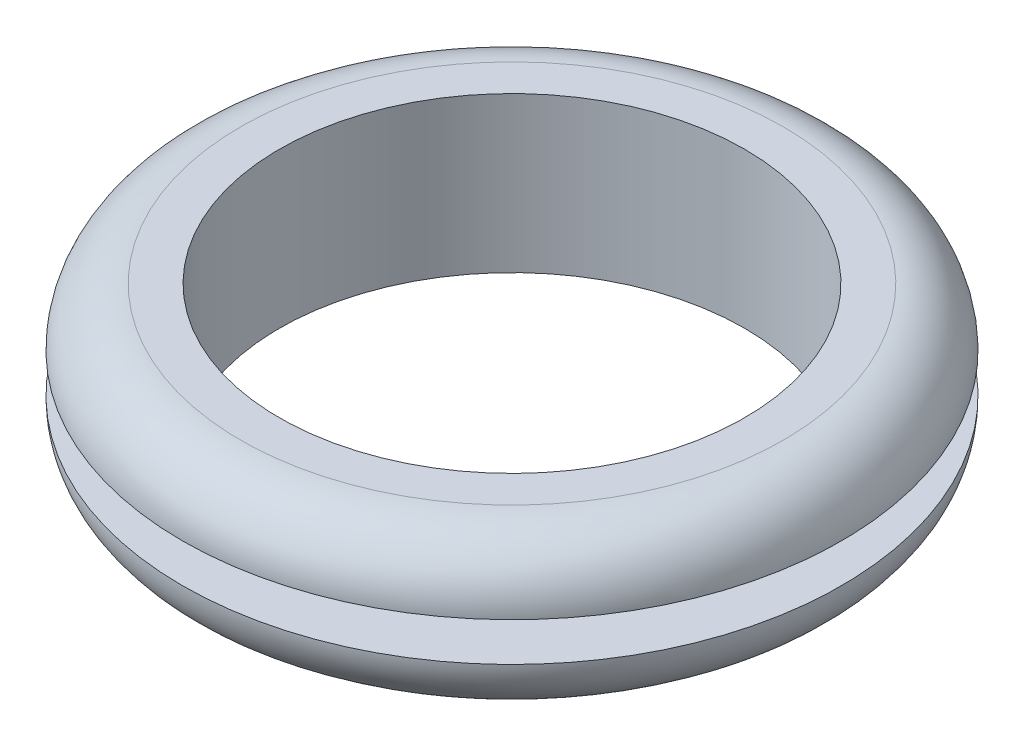
ISO-10303-21;
HEADER;
FILE_DESCRIPTION(('STEP AP214'),'2;1');
FILE_NAME('part.step','',(''),(''),'','','');
FILE_SCHEMA(('AUTOMOTIVE_DESIGN { 1 0 10303 214 1 1 1 1 }'));
ENDSEC;
DATA;
#1=APPLICATION_CONTEXT('core data for automotive mechanical design processes');
#2=APPLICATION_PROTOCOL_DEFINITION('international standard','automotive_design',2000,#1);
#3=PRODUCT_CONTEXT('',#1,'mechanical');
#4=PRODUCT('Part','Part','',(#3));
#5=PRODUCT_RELATED_PRODUCT_CATEGORY('part','',(#4));
#6=PRODUCT_DEFINITION_FORMATION('','',#4);
#7=PRODUCT_DEFINITION_CONTEXT('part definition',#1,'design');
#8=PRODUCT_DEFINITION('design','',#6,#7);
#9=PRODUCT_DEFINITION_SHAPE('','',#8);
#10=(LENGTH_UNIT() NAMED_UNIT(*) SI_UNIT(.MILLI.,.METRE.));
#11=(NAMED_UNIT(*) PLANE_ANGLE_UNIT() SI_UNIT($,.RADIAN.));
#12=(NAMED_UNIT(*) SI_UNIT($,.STERADIAN.) SOLID_ANGLE_UNIT());
#13=UNCERTAINTY_MEASURE_WITH_UNIT(LENGTH_MEASURE(1.E-05),#10,'distance_accuracy_value','');
#14=(GEOMETRIC_REPRESENTATION_CONTEXT(3) GLOBAL_UNCERTAINTY_ASSIGNED_CONTEXT((#13)) GLOBAL_UNIT_ASSIGNED_CONTEXT((#10,
#11,#12)) REPRESENTATION_CONTEXT('',''));
#15=CARTESIAN_POINT('',(0.,0.,0.));
#16=DIRECTION('',(0.,0.,1.));
#17=DIRECTION('',(1.,0.,0.));
#18=AXIS2_PLACEMENT_3D('',#15,#16,#17);
#19=CARTESIAN_POINT('',(0.,-6.35,19.05));
#20=DIRECTION('',(0.,1.,0.));
#21=DIRECTION('',(0.,0.,1.));
#22=AXIS2_PLACEMENT_3D('',#19,#20,#21);
#23=PLANE('',#22);
#24=CARTESIAN_POINT('',(0.,-6.35,0.));
#25=DIRECTION('',(0.,-1.,0.));
#26=DIRECTION('',(0.,0.,-1.));
#27=AXIS2_PLACEMENT_3D('',#24,#25,#26);
#28=CIRCLE('',#27,19.05);
#29=CARTESIAN_POINT('',(0.,-6.35,-19.05));
#30=VERTEX_POINT('',#29);
#31=EDGE_CURVE('E10',#30,#30,#28,.T.);
#32=ORIENTED_EDGE('',*,*,#31,.F.);
#33=EDGE_LOOP('',(#32));
#34=FACE_BOUND('',#33,.T.);
#35=CARTESIAN_POINT('',(0.,-6.35,0.));
#36=DIRECTION('',(0.,-1.,0.));
#37=DIRECTION('',(0.,0.,-1.));
#38=AXIS2_PLACEMENT_3D('',#35,#36,#37);
#39=CIRCLE('',#38,22.225);
#40=CARTESIAN_POINT('',(0.,-6.35,-22.225));
#41=VERTEX_POINT('',#40);
#42=EDGE_CURVE('E60',#41,#41,#39,.T.);
#43=ORIENTED_EDGE('',*,*,#42,.T.);
#44=EDGE_LOOP('',(#43));
#45=FACE_BOUND('',#44,.T.);
#46=ADVANCED_FACE('F32',(#34,#45),#23,.F.);
#47=CARTESIAN_POINT('',(0.,-6.35,0.));
#48=DIRECTION('',(0.,-1.,0.));
#49=DIRECTION('',(0.,0.,-1.));
#50=AXIS2_PLACEMENT_3D('',#47,#48,#49);
#51=CYLINDRICAL_SURFACE('',#50,19.05);
#52=CARTESIAN_POINT('',(0.,6.35,0.));
#53=DIRECTION('',(0.,-1.,0.));
#54=DIRECTION('',(0.,0.,-1.));
#55=AXIS2_PLACEMENT_3D('',#52,#53,#54);
#56=CIRCLE('',#55,19.05);
#57=CARTESIAN_POINT('',(0.,6.35,-19.05));
#58=VERTEX_POINT('',#57);
#59=EDGE_CURVE('E38',#58,#58,#56,.T.);
#60=ORIENTED_EDGE('',*,*,#59,.F.);
#61=EDGE_LOOP('',(#60));
#62=FACE_BOUND('',#61,.T.);
#63=ORIENTED_EDGE('',*,*,#31,.T.);
#64=EDGE_LOOP('',(#63));
#65=FACE_BOUND('',#64,.T.);
#66=ADVANCED_FACE('F97',(#62,#65),#51,.F.);
#67=CARTESIAN_POINT('',(0.,6.35,19.05));
#68=DIRECTION('',(0.,-1.,0.));
#69=DIRECTION('',(0.,0.,-1.));
#70=AXIS2_PLACEMENT_3D('',#67,#68,#69);
#71=PLANE('',#70);
#72=CARTESIAN_POINT('',(0.,6.35,0.));
#73=DIRECTION('',(0.,-1.,0.));
#74=DIRECTION('',(0.,0.,-1.));
#75=AXIS2_PLACEMENT_3D('',#72,#73,#74);
#76=CIRCLE('',#75,22.225);
#77=CARTESIAN_POINT('',(0.,6.35,-22.225));
#78=VERTEX_POINT('',#77);
#79=EDGE_CURVE('E42',#78,#78,#76,.T.);
#80=ORIENTED_EDGE('',*,*,#79,.F.);
#81=EDGE_LOOP('',(#80));
#82=FACE_BOUND('',#81,.T.);
#83=ORIENTED_EDGE('',*,*,#59,.T.);
#84=EDGE_LOOP('',(#83));
#85=FACE_BOUND('',#84,.T.);
#86=ADVANCED_FACE('F92',(#82,#85),#71,.F.);
#87=CARTESIAN_POINT('',(0.,1.5875,0.));
#88=DIRECTION('',(0.,-1.,0.));
#89=DIRECTION('',(0.,0.,-1.));
#90=AXIS2_PLACEMENT_3D('',#87,#88,#89);
#91=TOROIDAL_SURFACE('',#90,22.225,4.7625);
#92=CARTESIAN_POINT('',(0.,1.5875,0.));
#93=DIRECTION('',(0.,-1.,0.));
#94=DIRECTION('',(0.,0.,-1.));
#95=AXIS2_PLACEMENT_3D('',#92,#93,#94);
#96=CIRCLE('',#95,26.9875);
#97=CARTESIAN_POINT('',(0.,1.5875,-26.9875));
#98=VERTEX_POINT('',#97);
#99=EDGE_CURVE('E46',#98,#98,#96,.T.);
#100=ORIENTED_EDGE('',*,*,#99,.F.);
#101=EDGE_LOOP('',(#100));
#102=FACE_BOUND('',#101,.T.);
#103=ORIENTED_EDGE('',*,*,#79,.T.);
#104=EDGE_LOOP('',(#103));
#105=FACE_BOUND('',#104,.T.);
#106=ADVANCED_FACE('F86',(#102,#105),#91,.T.);
#107=CARTESIAN_POINT('',(0.,1.5875,22.225));
#108=DIRECTION('',(0.,1.,0.));
#109=DIRECTION('',(0.,0.,1.));
#110=AXIS2_PLACEMENT_3D('',#107,#108,#109);
#111=PLANE('',#110);
#112=CARTESIAN_POINT('',(0.,1.5875,0.));
#113=DIRECTION('',(0.,-1.,0.));
#114=DIRECTION('',(0.,0.,-1.));
#115=AXIS2_PLACEMENT_3D('',#112,#113,#114);
#116=CIRCLE('',#115,22.225);
#117=CARTESIAN_POINT('',(0.,1.5875,-22.225));
#118=VERTEX_POINT('',#117);
#119=EDGE_CURVE('E51',#118,#118,#116,.T.);
#120=ORIENTED_EDGE('',*,*,#119,.F.);
#121=EDGE_LOOP('',(#120));
#122=FACE_BOUND('',#121,.T.);
#123=ORIENTED_EDGE('',*,*,#99,.T.);
#124=EDGE_LOOP('',(#123));
#125=FACE_BOUND('',#124,.T.);
#126=ADVANCED_FACE('F80',(#122,#125),#111,.F.);
#127=CARTESIAN_POINT('',(0.,-6.35,0.));
#128=DIRECTION('',(0.,-1.,0.));
#129=DIRECTION('',(0.,0.,-1.));
#130=AXIS2_PLACEMENT_3D('',#127,#128,#129);
#131=CYLINDRICAL_SURFACE('',#130,22.225);
#132=CARTESIAN_POINT('',(0.,-1.5875,0.));
#133=DIRECTION('',(0.,-1.,0.));
#134=DIRECTION('',(0.,0.,-1.));
#135=AXIS2_PLACEMENT_3D('',#132,#133,#134);
#136=CIRCLE('',#135,22.225);
#137=CARTESIAN_POINT('',(0.,-1.5875,-22.225));
#138=VERTEX_POINT('',#137);
#139=EDGE_CURVE('E54',#138,#138,#136,.T.);
#140=ORIENTED_EDGE('',*,*,#139,.F.);
#141=EDGE_LOOP('',(#140));
#142=FACE_BOUND('',#141,.T.);
#143=ORIENTED_EDGE('',*,*,#119,.T.);
#144=EDGE_LOOP('',(#143));
#145=FACE_BOUND('',#144,.T.);
#146=ADVANCED_FACE('F74',(#142,#145),#131,.T.);
#147=CARTESIAN_POINT('',(0.,-1.5875,22.225));
#148=DIRECTION('',(0.,-1.,0.));
#149=DIRECTION('',(0.,0.,-1.));
#150=AXIS2_PLACEMENT_3D('',#147,#148,#149);
#151=PLANE('',#150);
#152=CARTESIAN_POINT('',(0.,-1.5875,0.));
#153=DIRECTION('',(0.,-1.,0.));
#154=DIRECTION('',(0.,0.,-1.));
#155=AXIS2_PLACEMENT_3D('',#152,#153,#154);
#156=CIRCLE('',#155,26.9875);
#157=CARTESIAN_POINT('',(0.,-1.5875,-26.9875));
#158=VERTEX_POINT('',#157);
#159=EDGE_CURVE('E57',#158,#158,#156,.T.);
#160=ORIENTED_EDGE('',*,*,#159,.F.);
#161=EDGE_LOOP('',(#160));
#162=FACE_BOUND('',#161,.T.);
#163=ORIENTED_EDGE('',*,*,#139,.T.);
#164=EDGE_LOOP('',(#163));
#165=FACE_BOUND('',#164,.T.);
#166=ADVANCED_FACE('F68',(#162,#165),#151,.F.);
#167=CARTESIAN_POINT('',(0.,-1.5875,0.));
#168=DIRECTION('',(0.,-1.,0.));
#169=DIRECTION('',(0.,0.,-1.));
#170=AXIS2_PLACEMENT_3D('',#167,#168,#169);
#171=TOROIDAL_SURFACE('',#170,22.225,4.7625);
#172=ORIENTED_EDGE('',*,*,#42,.F.);
#173=EDGE_LOOP('',(#172));
#174=FACE_BOUND('',#173,.T.);
#175=ORIENTED_EDGE('',*,*,#159,.T.);
#176=EDGE_LOOP('',(#175));
#177=FACE_BOUND('',#176,.T.);
#178=ADVANCED_FACE('F65',(#174,#177),#171,.T.);
#179=CLOSED_SHELL('',(#46,#66,#86,#106,#126,#146,#166,#178));
#180=MANIFOLD_SOLID_BREP('B2',#179);
#181=ADVANCED_BREP_SHAPE_REPRESENTATION('',(#18,#180),#14);
#182=SHAPE_DEFINITION_REPRESENTATION(#9,#181);
ENDSEC;
END-ISO-10303-21;
